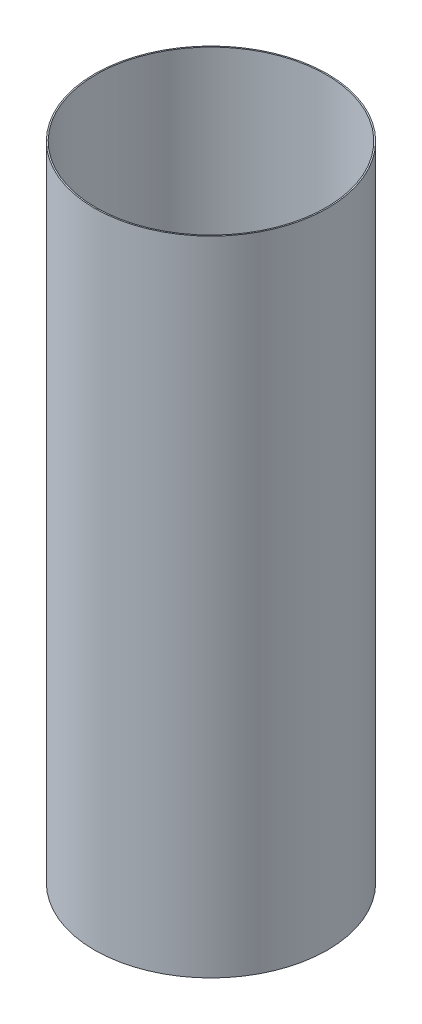
ISO-10303-21;
HEADER;
FILE_DESCRIPTION(('STEP AP214'),'2;1');
FILE_NAME('part.step','',(''),(''),'','','');
FILE_SCHEMA(('AUTOMOTIVE_DESIGN { 1 0 10303 214 1 1 1 1 }'));
ENDSEC;
DATA;
#1=APPLICATION_CONTEXT('core data for automotive mechanical design processes');
#2=APPLICATION_PROTOCOL_DEFINITION('international standard','automotive_design',2000,#1);
#3=PRODUCT_CONTEXT('',#1,'mechanical');
#4=PRODUCT('Part','Part','',(#3));
#5=PRODUCT_RELATED_PRODUCT_CATEGORY('part','',(#4));
#6=PRODUCT_DEFINITION_FORMATION('','',#4);
#7=PRODUCT_DEFINITION_CONTEXT('part definition',#1,'design');
#8=PRODUCT_DEFINITION('design','',#6,#7);
#9=PRODUCT_DEFINITION_SHAPE('','',#8);
#10=(LENGTH_UNIT() NAMED_UNIT(*) SI_UNIT(.MILLI.,.METRE.));
#11=(NAMED_UNIT(*) PLANE_ANGLE_UNIT() SI_UNIT($,.RADIAN.));
#12=(NAMED_UNIT(*) SI_UNIT($,.STERADIAN.) SOLID_ANGLE_UNIT());
#13=UNCERTAINTY_MEASURE_WITH_UNIT(LENGTH_MEASURE(1.E-05),#10,'distance_accuracy_value','');
#14=(GEOMETRIC_REPRESENTATION_CONTEXT(3) GLOBAL_UNCERTAINTY_ASSIGNED_CONTEXT((#13)) GLOBAL_UNIT_ASSIGNED_CONTEXT((#10,
#11,#12)) REPRESENTATION_CONTEXT('',''));
#15=CARTESIAN_POINT('',(0.,0.,0.));
#16=DIRECTION('',(0.,0.,1.));
#17=DIRECTION('',(1.,0.,0.));
#18=AXIS2_PLACEMENT_3D('',#15,#16,#17);
#19=CARTESIAN_POINT('',(0.,406.4,0.));
#20=DIRECTION('',(0.,1.,0.));
#21=DIRECTION('',(0.,0.,1.));
#22=AXIS2_PLACEMENT_3D('',#19,#20,#21);
#23=PLANE('',#22);
#24=CARTESIAN_POINT('',(0.,406.4,0.));
#25=DIRECTION('',(0.,1.,0.));
#26=DIRECTION('',(0.,0.,1.));
#27=AXIS2_PLACEMENT_3D('',#24,#25,#26);
#28=CIRCLE('',#27,73.66);
#29=CARTESIAN_POINT('',(0.,406.4,73.66));
#30=VERTEX_POINT('',#29);
#31=EDGE_CURVE('E10',#30,#30,#28,.T.);
#32=ORIENTED_EDGE('',*,*,#31,.T.);
#33=EDGE_LOOP('',(#32));
#34=FACE_BOUND('',#33,.T.);
#35=CARTESIAN_POINT('',(0.,406.4,0.));
#36=DIRECTION('',(0.,1.,0.));
#37=DIRECTION('',(0.,0.,1.));
#38=AXIS2_PLACEMENT_3D('',#35,#36,#37);
#39=CIRCLE('',#38,72.8472);
#40=CARTESIAN_POINT('',(0.,406.4,72.8472));
#41=VERTEX_POINT('',#40);
#42=EDGE_CURVE('E42',#41,#41,#39,.T.);
#43=ORIENTED_EDGE('',*,*,#42,.F.);
#44=EDGE_LOOP('',(#43));
#45=FACE_BOUND('',#44,.T.);
#46=ADVANCED_FACE('F31',(#34,#45),#23,.T.);
#47=CARTESIAN_POINT('',(0.,0.,0.));
#48=DIRECTION('',(0.,1.,0.));
#49=DIRECTION('',(0.,0.,1.));
#50=AXIS2_PLACEMENT_3D('',#47,#48,#49);
#51=PLANE('',#50);
#52=CARTESIAN_POINT('',(0.,0.,0.));
#53=DIRECTION('',(0.,1.,0.));
#54=DIRECTION('',(0.,0.,1.));
#55=AXIS2_PLACEMENT_3D('',#52,#53,#54);
#56=CIRCLE('',#55,73.66);
#57=CARTESIAN_POINT('',(0.,0.,73.66));
#58=VERTEX_POINT('',#57);
#59=EDGE_CURVE('E35',#58,#58,#56,.T.);
#60=ORIENTED_EDGE('',*,*,#59,.F.);
#61=EDGE_LOOP('',(#60));
#62=FACE_BOUND('',#61,.T.);
#63=CARTESIAN_POINT('',(0.,0.,0.));
#64=DIRECTION('',(0.,1.,0.));
#65=DIRECTION('',(0.,0.,1.));
#66=AXIS2_PLACEMENT_3D('',#63,#64,#65);
#67=CIRCLE('',#66,72.8472);
#68=CARTESIAN_POINT('',(0.,0.,72.8472));
#69=VERTEX_POINT('',#68);
#70=EDGE_CURVE('E44',#69,#69,#67,.T.);
#71=ORIENTED_EDGE('',*,*,#70,.T.);
#72=EDGE_LOOP('',(#71));
#73=FACE_BOUND('',#72,.T.);
#74=ADVANCED_FACE('F54',(#62,#73),#51,.F.);
#75=CARTESIAN_POINT('',(0.,406.4,0.));
#76=DIRECTION('',(0.,-1.,0.));
#77=DIRECTION('',(0.,0.,-1.));
#78=AXIS2_PLACEMENT_3D('',#75,#76,#77);
#79=CYLINDRICAL_SURFACE('',#78,73.66);
#80=ORIENTED_EDGE('',*,*,#31,.F.);
#81=EDGE_LOOP('',(#80));
#82=FACE_BOUND('',#81,.T.);
#83=ORIENTED_EDGE('',*,*,#59,.T.);
#84=EDGE_LOOP('',(#83));
#85=FACE_BOUND('',#84,.T.);
#86=ADVANCED_FACE('F33',(#82,#85),#79,.T.);
#87=CARTESIAN_POINT('',(0.,406.4,0.));
#88=DIRECTION('',(0.,-1.,0.));
#89=DIRECTION('',(0.,0.,-1.));
#90=AXIS2_PLACEMENT_3D('',#87,#88,#89);
#91=CYLINDRICAL_SURFACE('',#90,72.8472);
#92=ORIENTED_EDGE('',*,*,#42,.T.);
#93=EDGE_LOOP('',(#92));
#94=FACE_BOUND('',#93,.T.);
#95=ORIENTED_EDGE('',*,*,#70,.F.);
#96=EDGE_LOOP('',(#95));
#97=FACE_BOUND('',#96,.T.);
#98=ADVANCED_FACE('F50',(#94,#97),#91,.F.);
#99=CLOSED_SHELL('',(#46,#74,#86,#98));
#100=MANIFOLD_SOLID_BREP('B2',#99);
#101=ADVANCED_BREP_SHAPE_REPRESENTATION('',(#18,#100),#14);
#102=SHAPE_DEFINITION_REPRESENTATION(#9,#101);
ENDSEC;
END-ISO-10303-21;
